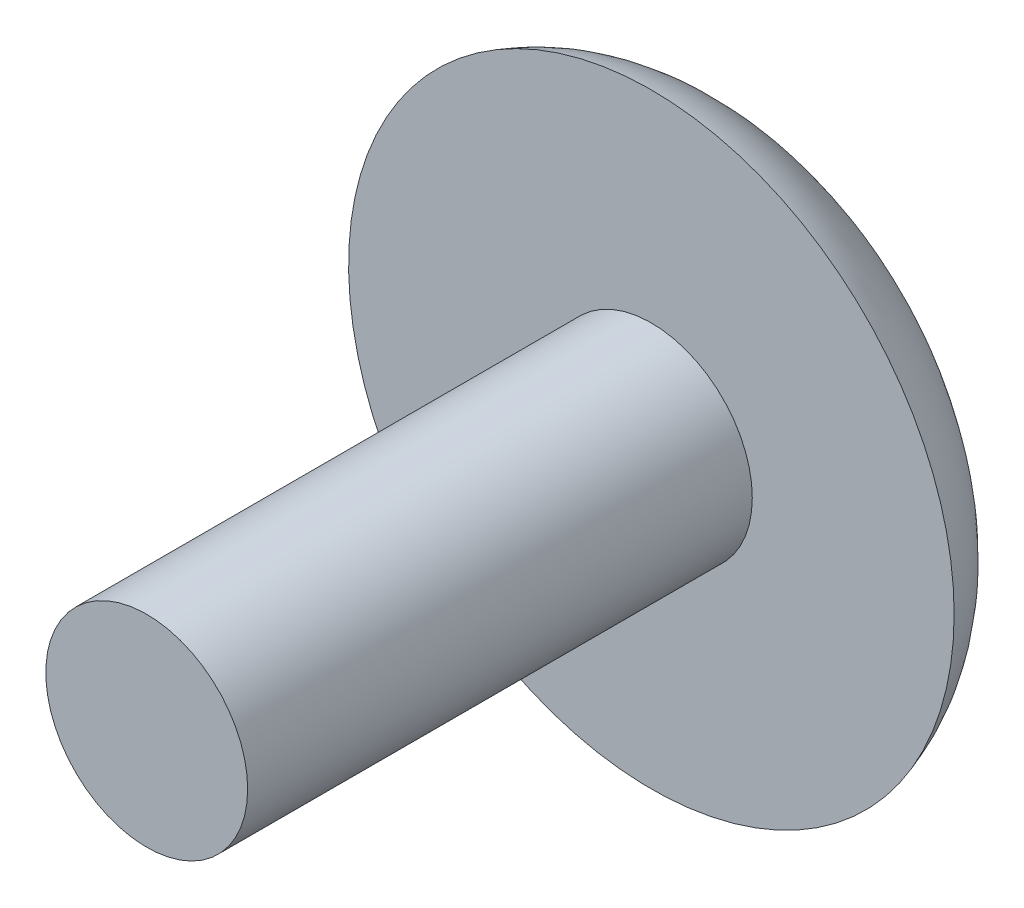
ISO-10303-21;
HEADER;
FILE_DESCRIPTION(('STEP AP214'),'2;1');
FILE_NAME('part.step','',(''),(''),'','','');
FILE_SCHEMA(('AUTOMOTIVE_DESIGN { 1 0 10303 214 1 1 1 1 }'));
ENDSEC;
DATA;
#1=APPLICATION_CONTEXT('core data for automotive mechanical design processes');
#2=APPLICATION_PROTOCOL_DEFINITION('international standard','automotive_design',2000,#1);
#3=PRODUCT_CONTEXT('',#1,'mechanical');
#4=PRODUCT('Part','Part','',(#3));
#5=PRODUCT_RELATED_PRODUCT_CATEGORY('part','',(#4));
#6=PRODUCT_DEFINITION_FORMATION('','',#4);
#7=PRODUCT_DEFINITION_CONTEXT('part definition',#1,'design');
#8=PRODUCT_DEFINITION('design','',#6,#7);
#9=PRODUCT_DEFINITION_SHAPE('','',#8);
#10=(LENGTH_UNIT() NAMED_UNIT(*) SI_UNIT(.MILLI.,.METRE.));
#11=(NAMED_UNIT(*) PLANE_ANGLE_UNIT() SI_UNIT($,.RADIAN.));
#12=(NAMED_UNIT(*) SI_UNIT($,.STERADIAN.) SOLID_ANGLE_UNIT());
#13=UNCERTAINTY_MEASURE_WITH_UNIT(LENGTH_MEASURE(1.E-05),#10,'distance_accuracy_value','');
#14=(GEOMETRIC_REPRESENTATION_CONTEXT(3) GLOBAL_UNCERTAINTY_ASSIGNED_CONTEXT((#13)) GLOBAL_UNIT_ASSIGNED_CONTEXT((#10,
#11,#12)) REPRESENTATION_CONTEXT('',''));
#15=CARTESIAN_POINT('',(0.,0.,0.));
#16=DIRECTION('',(0.,0.,1.));
#17=DIRECTION('',(1.,0.,0.));
#18=AXIS2_PLACEMENT_3D('',#15,#16,#17);
#19=CARTESIAN_POINT('',(0.,0.,0.));
#20=DIRECTION('',(0.,0.,1.));
#21=DIRECTION('',(1.,0.,0.));
#22=AXIS2_PLACEMENT_3D('',#19,#20,#21);
#23=PLANE('',#22);
#24=DIRECTION('',(0.,1.,0.));
#25=VECTOR('',#24,1.);
#26=CARTESIAN_POINT('',(-0.115,1.2,0.));
#27=LINE('',#26,#25);
#28=CARTESIAN_POINT('',(-0.115,-0.821166134378537,0.));
#29=VERTEX_POINT('',#28);
#30=CARTESIAN_POINT('',(-0.115000000000001,-0.115,0.));
#31=VERTEX_POINT('',#30);
#32=EDGE_CURVE('E149',#29,#31,#27,.T.);
#33=ORIENTED_EDGE('',*,*,#32,.F.);
#34=CARTESIAN_POINT('',(0.,0.,0.));
#35=DIRECTION('',(0.,0.,1.));
#36=DIRECTION('',(1.,0.,0.));
#37=AXIS2_PLACEMENT_3D('',#34,#35,#36);
#38=CIRCLE('',#37,0.829179606750063);
#39=CARTESIAN_POINT('',(-0.821166134378538,-0.114999999999997,0.));
#40=VERTEX_POINT('',#39);
#41=EDGE_CURVE('E277',#29,#40,#38,.F.);
#42=ORIENTED_EDGE('',*,*,#41,.T.);
#43=DIRECTION('',(-1.,0.,0.));
#44=VECTOR('',#43,1.);
#45=CARTESIAN_POINT('',(1.2,-0.115000000000004,0.));
#46=LINE('',#45,#44);
#47=EDGE_CURVE('E170',#31,#40,#46,.T.);
#48=ORIENTED_EDGE('',*,*,#47,.F.);
#49=EDGE_LOOP('',(#33,#42,#48));
#50=FACE_BOUND('',#49,.T.);
#51=ADVANCED_FACE('F36',(#50),#23,.F.);
#52=DIRECTION('',(1.,0.,0.));
#53=VECTOR('',#52,1.);
#54=CARTESIAN_POINT('',(1.2,0.114999999999996,0.));
#55=LINE('',#54,#53);
#56=CARTESIAN_POINT('',(-0.821166134378537,0.115000000000003,0.));
#57=VERTEX_POINT('',#56);
#58=CARTESIAN_POINT('',(-0.114999999999999,0.115000000000001,0.));
#59=VERTEX_POINT('',#58);
#60=EDGE_CURVE('E121',#57,#59,#55,.T.);
#61=ORIENTED_EDGE('',*,*,#60,.F.);
#62=CARTESIAN_POINT('',(0.,0.,0.));
#63=DIRECTION('',(0.,0.,1.));
#64=DIRECTION('',(1.,0.,0.));
#65=AXIS2_PLACEMENT_3D('',#62,#63,#64);
#66=CIRCLE('',#65,0.829179606750063);
#67=CARTESIAN_POINT('',(-0.115,0.821166134378537,0.));
#68=VERTEX_POINT('',#67);
#69=EDGE_CURVE('E148',#57,#68,#66,.F.);
#70=ORIENTED_EDGE('',*,*,#69,.T.);
#71=EDGE_CURVE('E139',#59,#68,#27,.T.);
#72=ORIENTED_EDGE('',*,*,#71,.F.);
#73=EDGE_LOOP('',(#61,#70,#72));
#74=FACE_BOUND('',#73,.T.);
#75=ADVANCED_FACE('F147',(#74),#23,.F.);
#76=DIRECTION('',(0.,-1.,0.));
#77=VECTOR('',#76,1.);
#78=CARTESIAN_POINT('',(0.115,1.2,0.));
#79=LINE('',#78,#77);
#80=CARTESIAN_POINT('',(0.115,0.821166134378537,0.));
#81=VERTEX_POINT('',#80);
#82=CARTESIAN_POINT('',(0.115000000000001,0.114999999999999,0.));
#83=VERTEX_POINT('',#82);
#84=EDGE_CURVE('E159',#81,#83,#79,.T.);
#85=ORIENTED_EDGE('',*,*,#84,.F.);
#86=CARTESIAN_POINT('',(0.,0.,0.));
#87=DIRECTION('',(0.,0.,1.));
#88=DIRECTION('',(1.,0.,0.));
#89=AXIS2_PLACEMENT_3D('',#86,#87,#88);
#90=CIRCLE('',#89,0.829179606750063);
#91=CARTESIAN_POINT('',(0.821166134378537,0.114999999999997,0.));
#92=VERTEX_POINT('',#91);
#93=EDGE_CURVE('E268',#81,#92,#90,.F.);
#94=ORIENTED_EDGE('',*,*,#93,.T.);
#95=EDGE_CURVE('E133',#83,#92,#55,.T.);
#96=ORIENTED_EDGE('',*,*,#95,.F.);
#97=EDGE_LOOP('',(#85,#94,#96));
#98=FACE_BOUND('',#97,.T.);
#99=ADVANCED_FACE('F351',(#98),#23,.F.);
#100=CARTESIAN_POINT('',(0.821166134378537,-0.115000000000003,0.));
#101=VERTEX_POINT('',#100);
#102=CARTESIAN_POINT('',(0.115,-0.115000000000001,0.));
#103=VERTEX_POINT('',#102);
#104=EDGE_CURVE('E166',#101,#103,#46,.T.);
#105=ORIENTED_EDGE('',*,*,#104,.F.);
#106=CARTESIAN_POINT('',(0.,0.,0.));
#107=DIRECTION('',(0.,0.,1.));
#108=DIRECTION('',(1.,0.,0.));
#109=AXIS2_PLACEMENT_3D('',#106,#107,#108);
#110=CIRCLE('',#109,0.829179606750063);
#111=CARTESIAN_POINT('',(0.115,-0.821166134378537,0.));
#112=VERTEX_POINT('',#111);
#113=EDGE_CURVE('E171',#101,#112,#110,.F.);
#114=ORIENTED_EDGE('',*,*,#113,.T.);
#115=EDGE_CURVE('E151',#103,#112,#79,.T.);
#116=ORIENTED_EDGE('',*,*,#115,.F.);
#117=EDGE_LOOP('',(#105,#114,#116));
#118=FACE_BOUND('',#117,.T.);
#119=ADVANCED_FACE('F209',(#118),#23,.F.);
#120=CARTESIAN_POINT('',(0.,0.,0.85));
#121=DIRECTION('',(0.99097150999577,0.,-0.134072616058251));
#122=DIRECTION('',(-0.134072616058251,0.,-0.99097150999577));
#123=AXIS2_PLACEMENT_3D('',#120,#121,#122);
#124=PLANE('',#123);
#125=ORIENTED_EDGE('',*,*,#71,.T.);
#126=CARTESIAN_POINT('',(-0.115,0.821166134378537,0.));
#127=CARTESIAN_POINT('',(-0.115003753401396,0.856506247271717,-2.77425320576674E-05));
#128=CARTESIAN_POINT('',(-0.114645510728595,0.891841148150952,0.00262013809299368));
#129=CARTESIAN_POINT('',(-0.113239684986047,0.961181080645869,0.013011024016172));
#130=CARTESIAN_POINT('',(-0.112202849377316,0.995198228157812,0.0206745915589666));
#131=CARTESIAN_POINT('',(-0.109664667188166,1.05705272399603,0.0394350686092088));
#132=CARTESIAN_POINT('',(-0.108248999430324,1.08508706105557,0.049898699862824));
#133=CARTESIAN_POINT('',(-0.106598096651028,1.11232796505421,0.0621010247532686));
#134=B_SPLINE_CURVE_WITH_KNOTS('',3,(#126,#127,#128,#129,#130,#131,#132,#133),.UNSPECIFIED.,.F.,
.F.,(4,2,2,4),(0.,0.105912296215382,0.210186487562887,0.299817379410098),.UNSPECIFIED.);
#135=CARTESIAN_POINT('',(-0.106598096651028,1.11232796505421,0.0621010247532698));
#136=VERTEX_POINT('',#135);
#137=EDGE_CURVE('E198',#68,#136,#134,.T.);
#138=ORIENTED_EDGE('',*,*,#137,.T.);
#139=DIRECTION('',(0.0779643099473924,-0.813540625538009,0.576257943089423));
#140=VECTOR('',#139,1.);
#141=CARTESIAN_POINT('',(-0.115,1.2,0.));
#142=LINE('',#141,#140);
#143=CARTESIAN_POINT('',(0.,0.,0.85));
#144=VERTEX_POINT('',#143);
#145=EDGE_CURVE('E142',#136,#144,#142,.T.);
#146=ORIENTED_EDGE('',*,*,#145,.T.);
#147=DIRECTION('',(-0.132883613022023,0.132883613022025,-0.982183226684526));
#148=VECTOR('',#147,1.);
#149=CARTESIAN_POINT('',(0.,0.,0.850000000000001));
#150=LINE('',#149,#148);
#151=EDGE_CURVE('E125',#144,#59,#150,.T.);
#152=ORIENTED_EDGE('',*,*,#151,.T.);
#153=EDGE_LOOP('',(#125,#138,#146,#152));
#154=FACE_BOUND('',#153,.T.);
#155=ADVANCED_FACE('F138',(#154),#124,.T.);
#156=DIRECTION('',(0.0779643099473926,0.813540625538009,0.576257943089423));
#157=VECTOR('',#156,1.);
#158=CARTESIAN_POINT('',(-0.115,-1.2,0.));
#159=LINE('',#158,#157);
#160=CARTESIAN_POINT('',(-0.106598096651028,-1.11232796505421,0.0621010247532698));
#161=VERTEX_POINT('',#160);
#162=EDGE_CURVE('E153',#161,#144,#159,.T.);
#163=ORIENTED_EDGE('',*,*,#162,.F.);
#164=CARTESIAN_POINT('',(-0.106598096651028,-1.11232796505421,0.0621010247532697));
#165=CARTESIAN_POINT('',(-0.107705462762497,-1.0940226261849,0.0539161447989334));
#166=CARTESIAN_POINT('',(-0.10870796936698,-1.07537662059871,0.0465063133744937));
#167=CARTESIAN_POINT('',(-0.110497409529243,-1.03751319040464,0.0332800165229877));
#168=CARTESIAN_POINT('',(-0.111284295311331,-1.01829564020202,0.0274639042205965));
#169=CARTESIAN_POINT('',(-0.113287038726333,-0.960683069148253,0.012661018109711));
#170=CARTESIAN_POINT('',(-0.114186295822091,-0.921641361860128,0.00601433522802392));
#171=CARTESIAN_POINT('',(-0.114882034792489,-0.86199311911084,0.000871916751167807));
#172=CARTESIAN_POINT('',(-0.115001120823655,-0.841569977033497,-8.28434875694907E-06));
#173=CARTESIAN_POINT('',(-0.115,-0.821166134378537,0.));
#174=B_SPLINE_CURVE_WITH_KNOTS('',3,(#164,#165,#166,#167,#168,#169,#170,#171,#172,#173),
.UNSPECIFIED.,.F.,.F.,(4,2,2,2,4),(0.,0.0602068572354957,0.120427043900717,0.238637438503415,
0.299877684740896),.UNSPECIFIED.);
#175=EDGE_CURVE('E12',#161,#29,#174,.T.);
#176=ORIENTED_EDGE('',*,*,#175,.T.);
#177=ORIENTED_EDGE('',*,*,#32,.T.);
#178=DIRECTION('',(0.132883613022025,0.132883613022023,0.982183226684526));
#179=VECTOR('',#178,1.);
#180=CARTESIAN_POINT('',(0.,0.,0.850000000000001));
#181=LINE('',#180,#179);
#182=EDGE_CURVE('E144',#31,#144,#181,.T.);
#183=ORIENTED_EDGE('',*,*,#182,.T.);
#184=EDGE_LOOP('',(#163,#176,#177,#183));
#185=FACE_BOUND('',#184,.T.);
#186=ADVANCED_FACE('F208',(#185),#124,.T.);
#187=CARTESIAN_POINT('',(0.,0.,0.850000000000001));
#188=DIRECTION('',(-0.99097150999577,0.,-0.134072616058251));
#189=DIRECTION('',(-0.134072616058251,0.,0.99097150999577));
#190=AXIS2_PLACEMENT_3D('',#187,#188,#189);
#191=PLANE('',#190);
#192=DIRECTION('',(-0.0779643099473926,-0.813540625538009,0.576257943089423));
#193=VECTOR('',#192,1.);
#194=CARTESIAN_POINT('',(0.115,1.2,0.));
#195=LINE('',#194,#193);
#196=CARTESIAN_POINT('',(0.106598096651028,1.11232796505421,0.0621010247532699));
#197=VERTEX_POINT('',#196);
#198=EDGE_CURVE('E132',#197,#144,#195,.T.);
#199=ORIENTED_EDGE('',*,*,#198,.F.);
#200=CARTESIAN_POINT('',(0.106598096651028,1.11232796505421,0.0621010247532699));
#201=CARTESIAN_POINT('',(0.107705462762497,1.0940226261849,0.0539161447989336));
#202=CARTESIAN_POINT('',(0.10870796936698,1.07537662059871,0.0465063133744939));
#203=CARTESIAN_POINT('',(0.110497409529243,1.03751319040464,0.0332800165229878));
#204=CARTESIAN_POINT('',(0.111284295311331,1.01829564020202,0.0274639042205965));
#205=CARTESIAN_POINT('',(0.113287038726333,0.960683069148253,0.0126610181097109));
#206=CARTESIAN_POINT('',(0.114186295822091,0.921641361860128,0.00601433522802387));
#207=CARTESIAN_POINT('',(0.114882034792489,0.86199311911084,0.000871916751167822));
#208=CARTESIAN_POINT('',(0.115001120823655,0.841569977033497,-8.28434875690998E-06));
#209=CARTESIAN_POINT('',(0.115,0.821166134378537,0.));
#210=B_SPLINE_CURVE_WITH_KNOTS('',3,(#200,#201,#202,#203,#204,#205,#206,#207,#208,#209),
.UNSPECIFIED.,.F.,.F.,(4,2,2,2,4),(0.,0.060206857235496,0.120427043900717,0.238637438503415,
0.299877684740896),.UNSPECIFIED.);
#211=EDGE_CURVE('E228',#197,#81,#210,.T.);
#212=ORIENTED_EDGE('',*,*,#211,.T.);
#213=ORIENTED_EDGE('',*,*,#84,.T.);
#214=DIRECTION('',(-0.132883613022025,-0.132883613022023,0.982183226684526));
#215=VECTOR('',#214,1.);
#216=CARTESIAN_POINT('',(0.,0.,0.85));
#217=LINE('',#216,#215);
#218=EDGE_CURVE('E341',#83,#144,#217,.T.);
#219=ORIENTED_EDGE('',*,*,#218,.T.);
#220=EDGE_LOOP('',(#199,#212,#213,#219));
#221=FACE_BOUND('',#220,.T.);
#222=ADVANCED_FACE('F235',(#221),#191,.T.);
#223=ORIENTED_EDGE('',*,*,#115,.T.);
#224=CARTESIAN_POINT('',(0.115,-0.821166134378537,0.));
#225=CARTESIAN_POINT('',(0.115003753401396,-0.856506247271717,-2.77425320576438E-05));
#226=CARTESIAN_POINT('',(0.114645510728595,-0.891841148150952,0.00262013809299372));
#227=CARTESIAN_POINT('',(0.113239684986047,-0.961181080645869,0.0130110240161721));
#228=CARTESIAN_POINT('',(0.112202849377316,-0.995198228157812,0.0206745915589667));
#229=CARTESIAN_POINT('',(0.109664667188166,-1.05705272399603,0.0394350686092087));
#230=CARTESIAN_POINT('',(0.108248999430324,-1.08508706105557,0.0498986998628238));
#231=CARTESIAN_POINT('',(0.106598096651028,-1.11232796505421,0.0621010247532683));
#232=B_SPLINE_CURVE_WITH_KNOTS('',3,(#224,#225,#226,#227,#228,#229,#230,#231),.UNSPECIFIED.,.F.,
.F.,(4,2,2,4),(0.,0.105912296215382,0.210186487562887,0.299817379410097),.UNSPECIFIED.);
#233=CARTESIAN_POINT('',(0.106598096651028,-1.11232796505421,0.0621010247532698));
#234=VERTEX_POINT('',#233);
#235=EDGE_CURVE('E63',#112,#234,#232,.T.);
#236=ORIENTED_EDGE('',*,*,#235,.T.);
#237=DIRECTION('',(-0.0779643099473924,0.813540625538009,0.576257943089423));
#238=VECTOR('',#237,1.);
#239=CARTESIAN_POINT('',(0.115,-1.2,0.));
#240=LINE('',#239,#238);
#241=EDGE_CURVE('E250',#234,#144,#240,.T.);
#242=ORIENTED_EDGE('',*,*,#241,.T.);
#243=DIRECTION('',(0.132883613022023,-0.132883613022025,-0.982183226684526));
#244=VECTOR('',#243,1.);
#245=CARTESIAN_POINT('',(0.,0.,0.85));
#246=LINE('',#245,#244);
#247=EDGE_CURVE('E145',#144,#103,#246,.T.);
#248=ORIENTED_EDGE('',*,*,#247,.T.);
#249=EDGE_LOOP('',(#223,#236,#242,#248));
#250=FACE_BOUND('',#249,.T.);
#251=ADVANCED_FACE('F239',(#250),#191,.T.);
#252=CARTESIAN_POINT('',(0.,0.,0.5));
#253=DIRECTION('',(0.,0.,1.));
#254=DIRECTION('',(1.,0.,0.));
#255=AXIS2_PLACEMENT_3D('',#252,#253,#254);
#256=PLANE('',#255);
#257=CARTESIAN_POINT('',(0.,0.,0.5));
#258=DIRECTION('',(0.,0.,1.));
#259=DIRECTION('',(1.,0.,0.));
#260=AXIS2_PLACEMENT_3D('',#257,#258,#259);
#261=CIRCLE('',#260,1.5);
#262=CARTESIAN_POINT('',(1.5,0.,0.5));
#263=VERTEX_POINT('',#262);
#264=EDGE_CURVE('E262',#263,#263,#261,.T.);
#265=ORIENTED_EDGE('',*,*,#264,.T.);
#266=EDGE_LOOP('',(#265));
#267=FACE_BOUND('',#266,.T.);
#268=CARTESIAN_POINT('',(0.,0.,0.5));
#269=DIRECTION('',(0.,0.,1.));
#270=DIRECTION('',(1.,0.,0.));
#271=AXIS2_PLACEMENT_3D('',#268,#269,#270);
#272=CIRCLE('',#271,0.5);
#273=CARTESIAN_POINT('',(0.5,0.,0.5));
#274=VERTEX_POINT('',#273);
#275=EDGE_CURVE('E263',#274,#274,#272,.T.);
#276=ORIENTED_EDGE('',*,*,#275,.F.);
#277=EDGE_LOOP('',(#276));
#278=FACE_BOUND('',#277,.T.);
#279=ADVANCED_FACE('F409',(#267,#278),#256,.T.);
#280=CARTESIAN_POINT('',(0.,0.,3.));
#281=DIRECTION('',(0.,0.,-1.));
#282=DIRECTION('',(-1.,0.,0.));
#283=AXIS2_PLACEMENT_3D('',#280,#281,#282);
#284=CYLINDRICAL_SURFACE('',#283,0.5);
#285=CARTESIAN_POINT('',(0.,0.,3.));
#286=DIRECTION('',(0.,0.,1.));
#287=DIRECTION('',(1.,0.,0.));
#288=AXIS2_PLACEMENT_3D('',#285,#286,#287);
#289=CIRCLE('',#288,0.5);
#290=CARTESIAN_POINT('',(0.5,0.,3.));
#291=VERTEX_POINT('',#290);
#292=EDGE_CURVE('E259',#291,#291,#289,.T.);
#293=ORIENTED_EDGE('',*,*,#292,.F.);
#294=EDGE_LOOP('',(#293));
#295=FACE_BOUND('',#294,.T.);
#296=ORIENTED_EDGE('',*,*,#275,.T.);
#297=EDGE_LOOP('',(#296));
#298=FACE_BOUND('',#297,.T.);
#299=ADVANCED_FACE('F475',(#295,#298),#284,.T.);
#300=CARTESIAN_POINT('',(0.,0.,3.));
#301=DIRECTION('',(0.,0.,1.));
#302=DIRECTION('',(1.,0.,0.));
#303=AXIS2_PLACEMENT_3D('',#300,#301,#302);
#304=PLANE('',#303);
#305=ORIENTED_EDGE('',*,*,#292,.T.);
#306=EDGE_LOOP('',(#305));
#307=FACE_BOUND('',#306,.T.);
#308=ADVANCED_FACE('F219',(#307),#304,.T.);
#309=CARTESIAN_POINT('',(-0.115,1.2,0.));
#310=DIRECTION('',(0.,0.578017340780339,0.816024481101655));
#311=DIRECTION('',(0.,-0.816024481101655,0.578017340780339));
#312=AXIS2_PLACEMENT_3D('',#309,#310,#311);
#313=PLANE('',#312);
#314=ORIENTED_EDGE('',*,*,#145,.F.);
#315=CARTESIAN_POINT('',(-0.106598096651028,1.11232796505421,0.0621010247532699));
#316=CARTESIAN_POINT('',(-0.071065397767352,1.11364590670727,0.0611674827490201));
#317=CARTESIAN_POINT('',(-0.0355326988836759,1.1143048775338,0.0607007117468952));
#318=CARTESIAN_POINT('',(0.0355326988836762,1.1143048775338,0.0607007117468951));
#319=CARTESIAN_POINT('',(0.0710653977673522,1.11364590670727,0.06116748274902));
#320=CARTESIAN_POINT('',(0.106598096651028,1.11232796505421,0.0621010247532698));
#321=B_SPLINE_CURVE_WITH_KNOTS('',3,(#315,#316,#317,#318,#319,#320),.UNSPECIFIED.,.F.,.F.,(4,2,
4),(0.,0.10662562201033,0.21325124402066),.UNSPECIFIED.);
#322=EDGE_CURVE('E203',#136,#197,#321,.T.);
#323=ORIENTED_EDGE('',*,*,#322,.T.);
#324=ORIENTED_EDGE('',*,*,#198,.T.);
#325=EDGE_LOOP('',(#314,#323,#324));
#326=FACE_BOUND('',#325,.T.);
#327=ADVANCED_FACE('F213',(#326),#313,.F.);
#328=CARTESIAN_POINT('',(0.115,-1.2,0.));
#329=DIRECTION('',(0.,-0.578017340780339,0.816024481101655));
#330=DIRECTION('',(0.,-0.816024481101655,-0.578017340780339));
#331=AXIS2_PLACEMENT_3D('',#328,#329,#330);
#332=PLANE('',#331);
#333=ORIENTED_EDGE('',*,*,#241,.F.);
#334=CARTESIAN_POINT('',(0.106598096651028,-1.11232796505421,0.0621010247532697));
#335=CARTESIAN_POINT('',(0.071065397767352,-1.11364590670727,0.0611674827490199));
#336=CARTESIAN_POINT('',(0.035532698883676,-1.11430487753379,0.060700711746895));
#337=CARTESIAN_POINT('',(-0.0355326988836762,-1.11430487753379,0.060700711746895));
#338=CARTESIAN_POINT('',(-0.0710653977673522,-1.11364590670727,0.0611674827490199));
#339=CARTESIAN_POINT('',(-0.106598096651028,-1.11232796505421,0.0621010247532697));
#340=B_SPLINE_CURVE_WITH_KNOTS('',3,(#334,#335,#336,#337,#338,#339),.UNSPECIFIED.,.F.,.F.,(4,2,
4),(0.,0.10662562201033,0.21325124402066),.UNSPECIFIED.);
#341=EDGE_CURVE('E49',#234,#161,#340,.T.);
#342=ORIENTED_EDGE('',*,*,#341,.T.);
#343=ORIENTED_EDGE('',*,*,#162,.T.);
#344=EDGE_LOOP('',(#333,#342,#343));
#345=FACE_BOUND('',#344,.T.);
#346=ADVANCED_FACE('F218',(#345),#332,.F.);
#347=CARTESIAN_POINT('',(0.,0.,0.850000000000001));
#348=DIRECTION('',(0.,0.99097150999577,-0.134072616058251));
#349=DIRECTION('',(0.,0.134072616058251,0.99097150999577));
#350=AXIS2_PLACEMENT_3D('',#347,#348,#349);
#351=PLANE('',#350);
#352=DIRECTION('',(-0.813540625538009,0.0779643099473954,0.576257943089423));
#353=VECTOR('',#352,1.);
#354=CARTESIAN_POINT('',(1.2,-0.115000000000004,0.));
#355=LINE('',#354,#353);
#356=CARTESIAN_POINT('',(1.11232796505421,-0.106598096651032,0.0621010247532699));
#357=VERTEX_POINT('',#356);
#358=EDGE_CURVE('E169',#357,#144,#355,.T.);
#359=ORIENTED_EDGE('',*,*,#358,.F.);
#360=CARTESIAN_POINT('',(1.11232796505421,-0.106598096651032,0.0621010247532699));
#361=CARTESIAN_POINT('',(1.0940226261849,-0.107705462762501,0.0539161447989335));
#362=CARTESIAN_POINT('',(1.07537662059871,-0.108707969366984,0.0465063133744938));
#363=CARTESIAN_POINT('',(1.03751319040464,-0.110497409529247,0.0332800165229878));
#364=CARTESIAN_POINT('',(1.01829564020202,-0.111284295311335,0.0274639042205966));
#365=CARTESIAN_POINT('',(0.960683069148253,-0.113287038726337,0.012661018109711));
#366=CARTESIAN_POINT('',(0.921641361860127,-0.114186295822094,0.00601433522802387));
#367=CARTESIAN_POINT('',(0.86199311911084,-0.114882034792492,0.00087191675116775));
#368=CARTESIAN_POINT('',(0.841569977033496,-0.115001120823658,-8.28434875698792E-06));
#369=CARTESIAN_POINT('',(0.821166134378537,-0.115000000000003,0.));
#370=B_SPLINE_CURVE_WITH_KNOTS('',3,(#360,#361,#362,#363,#364,#365,#366,#367,#368,#369),
.UNSPECIFIED.,.F.,.F.,(4,2,2,2,4),(0.,0.060206857235496,0.120427043900717,0.238637438503415,
0.299877684740896),.UNSPECIFIED.);
#371=EDGE_CURVE('E249',#357,#101,#370,.T.);
#372=ORIENTED_EDGE('',*,*,#371,.T.);
#373=ORIENTED_EDGE('',*,*,#104,.T.);
#374=ORIENTED_EDGE('',*,*,#247,.F.);
#375=EDGE_LOOP('',(#359,#372,#373,#374));
#376=FACE_BOUND('',#375,.T.);
#377=ADVANCED_FACE('F221',(#376),#351,.T.);
#378=CARTESIAN_POINT('',(0.,0.,0.85));
#379=DIRECTION('',(0.,-0.99097150999577,-0.134072616058251));
#380=DIRECTION('',(0.,0.134072616058251,-0.99097150999577));
#381=AXIS2_PLACEMENT_3D('',#378,#379,#380);
#382=PLANE('',#381);
#383=ORIENTED_EDGE('',*,*,#95,.T.);
#384=CARTESIAN_POINT('',(0.821166134378537,0.114999999999997,0.));
#385=CARTESIAN_POINT('',(0.856506247271717,0.115003753401393,-2.77425320575733E-05));
#386=CARTESIAN_POINT('',(0.891841148150952,0.114645510728592,0.00262013809299377));
#387=CARTESIAN_POINT('',(0.961181080645869,0.113239684986044,0.013011024016172));
#388=CARTESIAN_POINT('',(0.995198228157812,0.112202849377313,0.0206745915589666));
#389=CARTESIAN_POINT('',(1.05705272399603,0.109664667188162,0.0394350686092087));
#390=CARTESIAN_POINT('',(1.08508706105557,0.10824899943032,0.0498986998628238));
#391=CARTESIAN_POINT('',(1.11232796505421,0.106598096651024,0.0621010247532684));
#392=B_SPLINE_CURVE_WITH_KNOTS('',3,(#384,#385,#386,#387,#388,#389,#390,#391),.UNSPECIFIED.,.F.,
.F.,(4,2,2,4),(0.,0.105912296215382,0.210186487562887,0.299817379410098),.UNSPECIFIED.);
#393=CARTESIAN_POINT('',(1.11232796505421,0.106598096651024,0.0621010247532699));
#394=VERTEX_POINT('',#393);
#395=EDGE_CURVE('E233',#92,#394,#392,.T.);
#396=ORIENTED_EDGE('',*,*,#395,.T.);
#397=DIRECTION('',(-0.813540625538009,-0.0779643099473896,0.576257943089423));
#398=VECTOR('',#397,1.);
#399=CARTESIAN_POINT('',(1.2,0.114999999999996,0.));
#400=LINE('',#399,#398);
#401=EDGE_CURVE('E186',#394,#144,#400,.T.);
#402=ORIENTED_EDGE('',*,*,#401,.T.);
#403=ORIENTED_EDGE('',*,*,#218,.F.);
#404=EDGE_LOOP('',(#383,#396,#402,#403));
#405=FACE_BOUND('',#404,.T.);
#406=ADVANCED_FACE('F210',(#405),#382,.T.);
#407=CARTESIAN_POINT('',(1.2,0.114999999999996,0.));
#408=DIRECTION('',(0.578017340780339,0.,0.816024481101655));
#409=DIRECTION('',(-0.816024481101655,0.,0.578017340780339));
#410=AXIS2_PLACEMENT_3D('',#407,#408,#409);
#411=PLANE('',#410);
#412=ORIENTED_EDGE('',*,*,#401,.F.);
#413=CARTESIAN_POINT('',(1.11232796505421,0.106598096651024,0.0621010247532699));
#414=CARTESIAN_POINT('',(1.11364590670727,0.0710653977673481,0.0611674827490201));
#415=CARTESIAN_POINT('',(1.1143048775338,0.035532698883672,0.0607007117468952));
#416=CARTESIAN_POINT('',(1.11430487753379,-0.0355326988836801,0.0607007117468951));
#417=CARTESIAN_POINT('',(1.11364590670727,-0.0710653977673562,0.06116748274902));
#418=CARTESIAN_POINT('',(1.11232796505421,-0.106598096651032,0.0621010247532698));
#419=B_SPLINE_CURVE_WITH_KNOTS('',3,(#413,#414,#415,#416,#417,#418),.UNSPECIFIED.,.F.,.F.,(4,2,
4),(0.,0.10662562201033,0.21325124402066),.UNSPECIFIED.);
#420=EDGE_CURVE('E312',#394,#357,#419,.T.);
#421=ORIENTED_EDGE('',*,*,#420,.T.);
#422=ORIENTED_EDGE('',*,*,#358,.T.);
#423=EDGE_LOOP('',(#412,#421,#422));
#424=FACE_BOUND('',#423,.T.);
#425=ADVANCED_FACE('F307',(#424),#411,.F.);
#426=DIRECTION('',(0.813540625538009,-0.0779643099473955,0.576257943089423));
#427=VECTOR('',#426,1.);
#428=CARTESIAN_POINT('',(-1.2,0.115000000000004,0.));
#429=LINE('',#428,#427);
#430=CARTESIAN_POINT('',(-1.11232796505421,0.106598096651032,0.06210102475327));
#431=VERTEX_POINT('',#430);
#432=EDGE_CURVE('E286',#431,#144,#429,.T.);
#433=ORIENTED_EDGE('',*,*,#432,.F.);
#434=CARTESIAN_POINT('',(-1.11232796505421,0.106598096651032,0.0621010247532699));
#435=CARTESIAN_POINT('',(-1.0940226261849,0.107705462762501,0.0539161447989335));
#436=CARTESIAN_POINT('',(-1.07537662059871,0.108707969366984,0.0465063133744937));
#437=CARTESIAN_POINT('',(-1.03751319040464,0.110497409529247,0.0332800165229876));
#438=CARTESIAN_POINT('',(-1.01829564020202,0.111284295311335,0.0274639042205964));
#439=CARTESIAN_POINT('',(-0.960683069148252,0.113287038726337,0.0126610181097108));
#440=CARTESIAN_POINT('',(-0.921641361860127,0.114186295822094,0.00601433522802375));
#441=CARTESIAN_POINT('',(-0.861993119110839,0.114882034792492,0.000871916751167739));
#442=CARTESIAN_POINT('',(-0.841569977033496,0.115001120823658,-8.28434875697229E-06));
#443=CARTESIAN_POINT('',(-0.821166134378537,0.115000000000003,0.));
#444=B_SPLINE_CURVE_WITH_KNOTS('',3,(#434,#435,#436,#437,#438,#439,#440,#441,#442,#443),
.UNSPECIFIED.,.F.,.F.,(4,2,2,2,4),(0.,0.060206857235496,0.120427043900717,0.238637438503415,
0.299877684740896),.UNSPECIFIED.);
#445=EDGE_CURVE('E128',#431,#57,#444,.T.);
#446=ORIENTED_EDGE('',*,*,#445,.T.);
#447=ORIENTED_EDGE('',*,*,#60,.T.);
#448=ORIENTED_EDGE('',*,*,#151,.F.);
#449=EDGE_LOOP('',(#433,#446,#447,#448));
#450=FACE_BOUND('',#449,.T.);
#451=ADVANCED_FACE('F124',(#450),#382,.T.);
#452=ORIENTED_EDGE('',*,*,#47,.T.);
#453=CARTESIAN_POINT('',(-0.821166134378537,-0.114999999999997,0.));
#454=CARTESIAN_POINT('',(-0.856506247271717,-0.115003753401393,-2.77425320575831E-05));
#455=CARTESIAN_POINT('',(-0.891841148150952,-0.114645510728592,0.00262013809299375));
#456=CARTESIAN_POINT('',(-0.961181080645869,-0.113239684986044,0.013011024016172));
#457=CARTESIAN_POINT('',(-0.995198228157812,-0.112202849377313,0.0206745915589666));
#458=CARTESIAN_POINT('',(-1.05705272399603,-0.109664667188162,0.0394350686092087));
#459=CARTESIAN_POINT('',(-1.08508706105557,-0.10824899943032,0.0498986998628238));
#460=CARTESIAN_POINT('',(-1.11232796505421,-0.106598096651024,0.0621010247532684));
#461=B_SPLINE_CURVE_WITH_KNOTS('',3,(#453,#454,#455,#456,#457,#458,#459,#460),.UNSPECIFIED.,.F.,
.F.,(4,2,2,4),(0.,0.105912296215382,0.210186487562887,0.299817379410097),.UNSPECIFIED.);
#462=CARTESIAN_POINT('',(-1.11232796505421,-0.106598096651024,0.0621010247532698));
#463=VERTEX_POINT('',#462);
#464=EDGE_CURVE('E282',#40,#463,#461,.T.);
#465=ORIENTED_EDGE('',*,*,#464,.T.);
#466=DIRECTION('',(0.813540625538009,0.0779643099473896,0.576257943089423));
#467=VECTOR('',#466,1.);
#468=CARTESIAN_POINT('',(-1.2,-0.114999999999996,0.));
#469=LINE('',#468,#467);
#470=EDGE_CURVE('E283',#463,#144,#469,.T.);
#471=ORIENTED_EDGE('',*,*,#470,.T.);
#472=ORIENTED_EDGE('',*,*,#182,.F.);
#473=EDGE_LOOP('',(#452,#465,#471,#472));
#474=FACE_BOUND('',#473,.T.);
#475=ADVANCED_FACE('F304',(#474),#351,.T.);
#476=CARTESIAN_POINT('',(-1.2,-0.114999999999996,0.));
#477=DIRECTION('',(-0.578017340780339,0.,0.816024481101655));
#478=DIRECTION('',(-0.816024481101655,0.,-0.578017340780339));
#479=AXIS2_PLACEMENT_3D('',#476,#477,#478);
#480=PLANE('',#479);
#481=ORIENTED_EDGE('',*,*,#470,.F.);
#482=CARTESIAN_POINT('',(-1.11232796505421,-0.106598096651024,0.0621010247532697));
#483=CARTESIAN_POINT('',(-1.11364590670727,-0.0710653977673481,0.0611674827490199));
#484=CARTESIAN_POINT('',(-1.11430487753379,-0.0355326988836721,0.060700711746895));
#485=CARTESIAN_POINT('',(-1.11430487753379,0.0355326988836801,0.060700711746895));
#486=CARTESIAN_POINT('',(-1.11364590670727,0.0710653977673562,0.0611674827490199));
#487=CARTESIAN_POINT('',(-1.11232796505421,0.106598096651032,0.0621010247532697));
#488=B_SPLINE_CURVE_WITH_KNOTS('',3,(#482,#483,#484,#485,#486,#487),.UNSPECIFIED.,.F.,.F.,(4,2,
4),(0.,0.10662562201033,0.21325124402066),.UNSPECIFIED.);
#489=EDGE_CURVE('E296',#463,#431,#488,.T.);
#490=ORIENTED_EDGE('',*,*,#489,.T.);
#491=ORIENTED_EDGE('',*,*,#432,.T.);
#492=EDGE_LOOP('',(#481,#490,#491));
#493=FACE_BOUND('',#492,.T.);
#494=ADVANCED_FACE('F301',(#493),#480,.F.);
#495=CARTESIAN_POINT('',(0.,0.,0.7));
#496=DIRECTION('',(0.,0.,-1.));
#497=DIRECTION('',(-1.,0.,0.));
#498=AXIS2_PLACEMENT_3D('',#495,#496,#497);
#499=TOROIDAL_SURFACE('',#498,0.829179606750063,0.7);
#500=ORIENTED_EDGE('',*,*,#464,.F.);
#501=ORIENTED_EDGE('',*,*,#41,.F.);
#502=ORIENTED_EDGE('',*,*,#175,.F.);
#503=ORIENTED_EDGE('',*,*,#341,.F.);
#504=ORIENTED_EDGE('',*,*,#235,.F.);
#505=ORIENTED_EDGE('',*,*,#113,.F.);
#506=ORIENTED_EDGE('',*,*,#371,.F.);
#507=ORIENTED_EDGE('',*,*,#420,.F.);
#508=ORIENTED_EDGE('',*,*,#395,.F.);
#509=ORIENTED_EDGE('',*,*,#93,.F.);
#510=ORIENTED_EDGE('',*,*,#211,.F.);
#511=ORIENTED_EDGE('',*,*,#322,.F.);
#512=ORIENTED_EDGE('',*,*,#137,.F.);
#513=ORIENTED_EDGE('',*,*,#69,.F.);
#514=ORIENTED_EDGE('',*,*,#445,.F.);
#515=ORIENTED_EDGE('',*,*,#489,.F.);
#516=EDGE_LOOP('',(#500,#501,#502,#503,#504,#505,#506,#507,#508,#509,#510,#511,#512,#513,#514,#515));
#517=FACE_BOUND('',#516,.T.);
#518=ORIENTED_EDGE('',*,*,#264,.F.);
#519=EDGE_LOOP('',(#518));
#520=FACE_BOUND('',#519,.T.);
#521=ADVANCED_FACE('F38',(#517,#520),#499,.T.);
#522=CLOSED_SHELL('',(#51,#75,#99,#119,#155,#186,#222,#251,#279,#299,#308,#327,#346,#377,#406,
#425,#451,#475,#494,#521));
#523=MANIFOLD_SOLID_BREP('B2',#522);
#524=ADVANCED_BREP_SHAPE_REPRESENTATION('',(#18,#523),#14);
#525=SHAPE_DEFINITION_REPRESENTATION(#9,#524);
ENDSEC;
END-ISO-10303-21;
